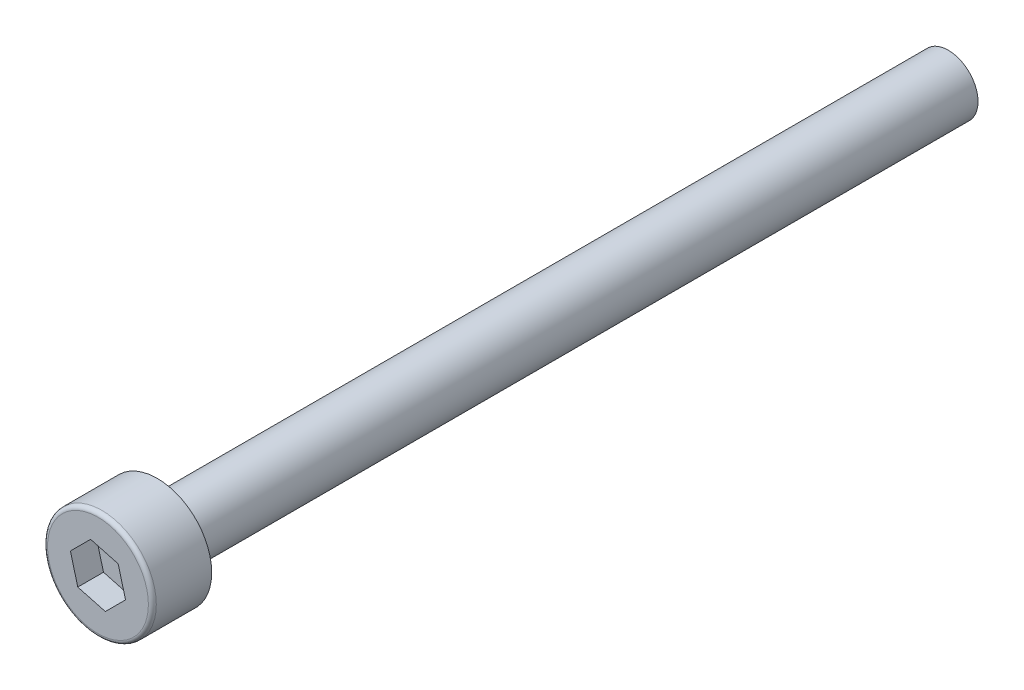
ISO-10303-21;
HEADER;
FILE_DESCRIPTION(('STEP AP214'),'2;1');
FILE_NAME('part.step','',(''),(''),'','','');
FILE_SCHEMA(('AUTOMOTIVE_DESIGN { 1 0 10303 214 1 1 1 1 }'));
ENDSEC;
DATA;
#1=APPLICATION_CONTEXT('core data for automotive mechanical design processes');
#2=APPLICATION_PROTOCOL_DEFINITION('international standard','automotive_design',2000,#1);
#3=PRODUCT_CONTEXT('',#1,'mechanical');
#4=PRODUCT('Part','Part','',(#3));
#5=PRODUCT_RELATED_PRODUCT_CATEGORY('part','',(#4));
#6=PRODUCT_DEFINITION_FORMATION('','',#4);
#7=PRODUCT_DEFINITION_CONTEXT('part definition',#1,'design');
#8=PRODUCT_DEFINITION('design','',#6,#7);
#9=PRODUCT_DEFINITION_SHAPE('','',#8);
#10=(LENGTH_UNIT() NAMED_UNIT(*) SI_UNIT(.MILLI.,.METRE.));
#11=(NAMED_UNIT(*) PLANE_ANGLE_UNIT() SI_UNIT($,.RADIAN.));
#12=(NAMED_UNIT(*) SI_UNIT($,.STERADIAN.) SOLID_ANGLE_UNIT());
#13=UNCERTAINTY_MEASURE_WITH_UNIT(LENGTH_MEASURE(1.E-05),#10,'distance_accuracy_value','');
#14=(GEOMETRIC_REPRESENTATION_CONTEXT(3) GLOBAL_UNCERTAINTY_ASSIGNED_CONTEXT((#13)) GLOBAL_UNIT_ASSIGNED_CONTEXT((#10,
#11,#12)) REPRESENTATION_CONTEXT('',''));
#15=CARTESIAN_POINT('',(0.,0.,0.));
#16=DIRECTION('',(0.,0.,1.));
#17=DIRECTION('',(1.,0.,0.));
#18=AXIS2_PLACEMENT_3D('',#15,#16,#17);
#19=CARTESIAN_POINT('',(0.,0.,0.));
#20=DIRECTION('',(0.,0.,1.));
#21=DIRECTION('',(1.,0.,0.));
#22=AXIS2_PLACEMENT_3D('',#19,#20,#21);
#23=PLANE('',#22);
#24=CARTESIAN_POINT('',(0.,0.,0.));
#25=DIRECTION('',(0.,0.,1.));
#26=DIRECTION('',(1.,0.,0.));
#27=AXIS2_PLACEMENT_3D('',#24,#25,#26);
#28=CIRCLE('',#27,2.75);
#29=CARTESIAN_POINT('',(2.75,0.,0.));
#30=VERTEX_POINT('',#29);
#31=EDGE_CURVE('E140',#30,#30,#28,.T.);
#32=ORIENTED_EDGE('',*,*,#31,.F.);
#33=EDGE_LOOP('',(#32));
#34=FACE_BOUND('',#33,.T.);
#35=CARTESIAN_POINT('',(0.,0.,0.));
#36=DIRECTION('',(0.,0.,1.));
#37=DIRECTION('',(1.,0.,0.));
#38=AXIS2_PLACEMENT_3D('',#35,#36,#37);
#39=CIRCLE('',#38,1.5);
#40=CARTESIAN_POINT('',(1.5,0.,0.));
#41=VERTEX_POINT('',#40);
#42=EDGE_CURVE('E148',#41,#41,#39,.F.);
#43=ORIENTED_EDGE('',*,*,#42,.F.);
#44=EDGE_LOOP('',(#43));
#45=FACE_BOUND('',#44,.T.);
#46=ADVANCED_FACE('F37',(#34,#45),#23,.F.);
#47=CARTESIAN_POINT('',(0.,0.,3.));
#48=DIRECTION('',(0.,0.,-1.));
#49=DIRECTION('',(-1.,0.,0.));
#50=AXIS2_PLACEMENT_3D('',#47,#48,#49);
#51=CYLINDRICAL_SURFACE('',#50,2.75);
#52=CARTESIAN_POINT('',(0.,0.,2.8));
#53=DIRECTION('',(0.,0.,1.));
#54=DIRECTION('',(1.,0.,0.));
#55=AXIS2_PLACEMENT_3D('',#52,#53,#54);
#56=CIRCLE('',#55,2.75);
#57=CARTESIAN_POINT('',(2.75,0.,2.8));
#58=VERTEX_POINT('',#57);
#59=EDGE_CURVE('E11',#58,#58,#56,.F.);
#60=ORIENTED_EDGE('',*,*,#59,.T.);
#61=EDGE_LOOP('',(#60));
#62=FACE_BOUND('',#61,.T.);
#63=ORIENTED_EDGE('',*,*,#31,.T.);
#64=EDGE_LOOP('',(#63));
#65=FACE_BOUND('',#64,.T.);
#66=ADVANCED_FACE('F167',(#62,#65),#51,.T.);
#67=CARTESIAN_POINT('',(0.,0.,3.));
#68=DIRECTION('',(0.,0.,1.));
#69=DIRECTION('',(1.,0.,0.));
#70=AXIS2_PLACEMENT_3D('',#67,#68,#69);
#71=PLANE('',#70);
#72=CARTESIAN_POINT('',(0.,0.,3.));
#73=DIRECTION('',(0.,0.,1.));
#74=DIRECTION('',(1.,0.,0.));
#75=AXIS2_PLACEMENT_3D('',#72,#73,#74);
#76=CIRCLE('',#75,2.55);
#77=CARTESIAN_POINT('',(2.55,0.,3.));
#78=VERTEX_POINT('',#77);
#79=EDGE_CURVE('E45',#78,#78,#76,.T.);
#80=ORIENTED_EDGE('',*,*,#79,.T.);
#81=EDGE_LOOP('',(#80));
#82=FACE_BOUND('',#81,.T.);
#83=DIRECTION('',(0.258819045102521,-0.965925826289068,0.));
#84=VECTOR('',#83,1.);
#85=CARTESIAN_POINT('',(-1.39419383956301,0.373573113403356,3.));
#86=LINE('',#85,#84);
#87=CARTESIAN_POINT('',(-1.39419383956301,0.373573113403356,3.));
#88=VERTEX_POINT('',#87);
#89=CARTESIAN_POINT('',(-1.02062072615966,-1.02062072615966,3.));
#90=VERTEX_POINT('',#89);
#91=EDGE_CURVE('E52',#88,#90,#86,.T.);
#92=ORIENTED_EDGE('',*,*,#91,.F.);
#93=DIRECTION('',(-0.707106781186548,-0.707106781186548,0.));
#94=VECTOR('',#93,1.);
#95=CARTESIAN_POINT('',(-0.373573113403355,1.39419383956301,3.));
#96=LINE('',#95,#94);
#97=CARTESIAN_POINT('',(-0.373573113403355,1.39419383956301,3.));
#98=VERTEX_POINT('',#97);
#99=EDGE_CURVE('E136',#98,#88,#96,.T.);
#100=ORIENTED_EDGE('',*,*,#99,.F.);
#101=DIRECTION('',(-0.965925826289068,0.258819045102521,0.));
#102=VECTOR('',#101,1.);
#103=CARTESIAN_POINT('',(1.02062072615966,1.02062072615966,3.));
#104=LINE('',#103,#102);
#105=CARTESIAN_POINT('',(1.02062072615966,1.02062072615966,3.));
#106=VERTEX_POINT('',#105);
#107=EDGE_CURVE('E134',#106,#98,#104,.T.);
#108=ORIENTED_EDGE('',*,*,#107,.F.);
#109=DIRECTION('',(-0.258819045102521,0.965925826289068,0.));
#110=VECTOR('',#109,1.);
#111=CARTESIAN_POINT('',(1.39419383956301,-0.373573113403355,3.));
#112=LINE('',#111,#110);
#113=CARTESIAN_POINT('',(1.39419383956301,-0.373573113403355,3.));
#114=VERTEX_POINT('',#113);
#115=EDGE_CURVE('E100',#114,#106,#112,.T.);
#116=ORIENTED_EDGE('',*,*,#115,.F.);
#117=DIRECTION('',(0.707106781186548,0.707106781186548,0.));
#118=VECTOR('',#117,1.);
#119=CARTESIAN_POINT('',(0.373573113403355,-1.39419383956301,3.));
#120=LINE('',#119,#118);
#121=CARTESIAN_POINT('',(0.373573113403355,-1.39419383956301,3.));
#122=VERTEX_POINT('',#121);
#123=EDGE_CURVE('E130',#122,#114,#120,.T.);
#124=ORIENTED_EDGE('',*,*,#123,.F.);
#125=DIRECTION('',(0.965925826289068,-0.258819045102521,0.));
#126=VECTOR('',#125,1.);
#127=CARTESIAN_POINT('',(-1.02062072615966,-1.02062072615966,3.));
#128=LINE('',#127,#126);
#129=EDGE_CURVE('E126',#90,#122,#128,.T.);
#130=ORIENTED_EDGE('',*,*,#129,.F.);
#131=EDGE_LOOP('',(#92,#100,#108,#116,#124,#130));
#132=FACE_BOUND('',#131,.T.);
#133=ADVANCED_FACE('F153',(#82,#132),#71,.T.);
#134=CARTESIAN_POINT('',(-1.39419383956301,0.373573113403356,1.7));
#135=DIRECTION('',(-0.965925826289068,-0.258819045102521,0.));
#136=DIRECTION('',(0.258819045102521,-0.965925826289068,0.));
#137=AXIS2_PLACEMENT_3D('',#134,#135,#136);
#138=PLANE('',#137);
#139=ORIENTED_EDGE('',*,*,#91,.T.);
#140=DIRECTION('',(0.,0.,1.));
#141=VECTOR('',#140,1.);
#142=CARTESIAN_POINT('',(-1.02062072615966,-1.02062072615966,1.7));
#143=LINE('',#142,#141);
#144=CARTESIAN_POINT('',(-1.02062072615966,-1.02062072615966,1.7));
#145=VERTEX_POINT('',#144);
#146=EDGE_CURVE('E82',#145,#90,#143,.T.);
#147=ORIENTED_EDGE('',*,*,#146,.F.);
#148=DIRECTION('',(0.258819045102521,-0.965925826289068,0.));
#149=VECTOR('',#148,1.);
#150=CARTESIAN_POINT('',(-1.39419383956301,0.373573113403356,1.7));
#151=LINE('',#150,#149);
#152=CARTESIAN_POINT('',(-1.39419383956301,0.373573113403356,1.7));
#153=VERTEX_POINT('',#152);
#154=EDGE_CURVE('E138',#153,#145,#151,.T.);
#155=ORIENTED_EDGE('',*,*,#154,.F.);
#156=DIRECTION('',(0.,0.,1.));
#157=VECTOR('',#156,1.);
#158=CARTESIAN_POINT('',(-1.39419383956301,0.373573113403356,1.7));
#159=LINE('',#158,#157);
#160=EDGE_CURVE('E60',#153,#88,#159,.T.);
#161=ORIENTED_EDGE('',*,*,#160,.T.);
#162=EDGE_LOOP('',(#139,#147,#155,#161));
#163=FACE_BOUND('',#162,.T.);
#164=ADVANCED_FACE('F179',(#163),#138,.F.);
#165=CARTESIAN_POINT('',(-0.373573113403355,1.39419383956301,1.7));
#166=DIRECTION('',(-0.707106781186548,0.707106781186548,0.));
#167=DIRECTION('',(-0.707106781186548,-0.707106781186548,0.));
#168=AXIS2_PLACEMENT_3D('',#165,#166,#167);
#169=PLANE('',#168);
#170=ORIENTED_EDGE('',*,*,#99,.T.);
#171=ORIENTED_EDGE('',*,*,#160,.F.);
#172=DIRECTION('',(-0.707106781186548,-0.707106781186548,0.));
#173=VECTOR('',#172,1.);
#174=CARTESIAN_POINT('',(-0.373573113403355,1.39419383956301,1.7));
#175=LINE('',#174,#173);
#176=CARTESIAN_POINT('',(-0.373573113403355,1.39419383956301,1.7));
#177=VERTEX_POINT('',#176);
#178=EDGE_CURVE('E112',#177,#153,#175,.T.);
#179=ORIENTED_EDGE('',*,*,#178,.F.);
#180=DIRECTION('',(0.,0.,1.));
#181=VECTOR('',#180,1.);
#182=CARTESIAN_POINT('',(-0.373573113403355,1.39419383956301,1.7));
#183=LINE('',#182,#181);
#184=EDGE_CURVE('E104',#177,#98,#183,.T.);
#185=ORIENTED_EDGE('',*,*,#184,.T.);
#186=EDGE_LOOP('',(#170,#171,#179,#185));
#187=FACE_BOUND('',#186,.T.);
#188=ADVANCED_FACE('F182',(#187),#169,.F.);
#189=CARTESIAN_POINT('',(1.02062072615966,1.02062072615966,1.7));
#190=DIRECTION('',(0.258819045102521,0.965925826289068,0.));
#191=DIRECTION('',(-0.965925826289068,0.258819045102521,0.));
#192=AXIS2_PLACEMENT_3D('',#189,#190,#191);
#193=PLANE('',#192);
#194=ORIENTED_EDGE('',*,*,#107,.T.);
#195=ORIENTED_EDGE('',*,*,#184,.F.);
#196=DIRECTION('',(-0.965925826289068,0.258819045102521,0.));
#197=VECTOR('',#196,1.);
#198=CARTESIAN_POINT('',(1.02062072615966,1.02062072615966,1.7));
#199=LINE('',#198,#197);
#200=CARTESIAN_POINT('',(1.02062072615966,1.02062072615966,1.7));
#201=VERTEX_POINT('',#200);
#202=EDGE_CURVE('E108',#201,#177,#199,.T.);
#203=ORIENTED_EDGE('',*,*,#202,.F.);
#204=DIRECTION('',(0.,0.,1.));
#205=VECTOR('',#204,1.);
#206=CARTESIAN_POINT('',(1.02062072615966,1.02062072615966,1.7));
#207=LINE('',#206,#205);
#208=EDGE_CURVE('E93',#201,#106,#207,.T.);
#209=ORIENTED_EDGE('',*,*,#208,.T.);
#210=EDGE_LOOP('',(#194,#195,#203,#209));
#211=FACE_BOUND('',#210,.T.);
#212=ADVANCED_FACE('F109',(#211),#193,.F.);
#213=CARTESIAN_POINT('',(1.39419383956301,-0.373573113403355,1.7));
#214=DIRECTION('',(0.965925826289068,0.258819045102521,0.));
#215=DIRECTION('',(-0.258819045102521,0.965925826289068,0.));
#216=AXIS2_PLACEMENT_3D('',#213,#214,#215);
#217=PLANE('',#216);
#218=ORIENTED_EDGE('',*,*,#115,.T.);
#219=ORIENTED_EDGE('',*,*,#208,.F.);
#220=DIRECTION('',(-0.258819045102521,0.965925826289068,0.));
#221=VECTOR('',#220,1.);
#222=CARTESIAN_POINT('',(1.39419383956301,-0.373573113403355,1.7));
#223=LINE('',#222,#221);
#224=CARTESIAN_POINT('',(1.39419383956301,-0.373573113403355,1.7));
#225=VERTEX_POINT('',#224);
#226=EDGE_CURVE('E97',#225,#201,#223,.T.);
#227=ORIENTED_EDGE('',*,*,#226,.F.);
#228=DIRECTION('',(0.,0.,1.));
#229=VECTOR('',#228,1.);
#230=CARTESIAN_POINT('',(1.39419383956301,-0.373573113403355,1.7));
#231=LINE('',#230,#229);
#232=EDGE_CURVE('E105',#225,#114,#231,.T.);
#233=ORIENTED_EDGE('',*,*,#232,.T.);
#234=EDGE_LOOP('',(#218,#219,#227,#233));
#235=FACE_BOUND('',#234,.T.);
#236=ADVANCED_FACE('F95',(#235),#217,.F.);
#237=CARTESIAN_POINT('',(0.373573113403355,-1.39419383956301,1.7));
#238=DIRECTION('',(0.707106781186548,-0.707106781186548,0.));
#239=DIRECTION('',(0.707106781186548,0.707106781186548,0.));
#240=AXIS2_PLACEMENT_3D('',#237,#238,#239);
#241=PLANE('',#240);
#242=ORIENTED_EDGE('',*,*,#123,.T.);
#243=ORIENTED_EDGE('',*,*,#232,.F.);
#244=DIRECTION('',(0.707106781186548,0.707106781186548,0.));
#245=VECTOR('',#244,1.);
#246=CARTESIAN_POINT('',(0.373573113403355,-1.39419383956301,1.7));
#247=LINE('',#246,#245);
#248=CARTESIAN_POINT('',(0.373573113403355,-1.39419383956301,1.7));
#249=VERTEX_POINT('',#248);
#250=EDGE_CURVE('E118',#249,#225,#247,.T.);
#251=ORIENTED_EDGE('',*,*,#250,.F.);
#252=DIRECTION('',(0.,0.,1.));
#253=VECTOR('',#252,1.);
#254=CARTESIAN_POINT('',(0.373573113403355,-1.39419383956301,1.7));
#255=LINE('',#254,#253);
#256=EDGE_CURVE('E143',#249,#122,#255,.T.);
#257=ORIENTED_EDGE('',*,*,#256,.T.);
#258=EDGE_LOOP('',(#242,#243,#251,#257));
#259=FACE_BOUND('',#258,.T.);
#260=ADVANCED_FACE('F186',(#259),#241,.F.);
#261=CARTESIAN_POINT('',(-1.02062072615966,-1.02062072615966,1.7));
#262=DIRECTION('',(-0.258819045102521,-0.965925826289068,0.));
#263=DIRECTION('',(0.965925826289068,-0.258819045102521,0.));
#264=AXIS2_PLACEMENT_3D('',#261,#262,#263);
#265=PLANE('',#264);
#266=ORIENTED_EDGE('',*,*,#129,.T.);
#267=ORIENTED_EDGE('',*,*,#256,.F.);
#268=DIRECTION('',(0.965925826289068,-0.258819045102521,0.));
#269=VECTOR('',#268,1.);
#270=CARTESIAN_POINT('',(-1.02062072615966,-1.02062072615966,1.7));
#271=LINE('',#270,#269);
#272=EDGE_CURVE('E120',#145,#249,#271,.T.);
#273=ORIENTED_EDGE('',*,*,#272,.F.);
#274=ORIENTED_EDGE('',*,*,#146,.T.);
#275=EDGE_LOOP('',(#266,#267,#273,#274));
#276=FACE_BOUND('',#275,.T.);
#277=ADVANCED_FACE('F183',(#276),#265,.F.);
#278=CARTESIAN_POINT('',(0.,0.,1.7));
#279=DIRECTION('',(0.,0.,1.));
#280=DIRECTION('',(1.,0.,0.));
#281=AXIS2_PLACEMENT_3D('',#278,#279,#280);
#282=PLANE('',#281);
#283=ORIENTED_EDGE('',*,*,#154,.T.);
#284=ORIENTED_EDGE('',*,*,#272,.T.);
#285=ORIENTED_EDGE('',*,*,#250,.T.);
#286=ORIENTED_EDGE('',*,*,#226,.T.);
#287=ORIENTED_EDGE('',*,*,#202,.T.);
#288=ORIENTED_EDGE('',*,*,#178,.T.);
#289=EDGE_LOOP('',(#283,#284,#285,#286,#287,#288));
#290=FACE_BOUND('',#289,.T.);
#291=ADVANCED_FACE('F115',(#290),#282,.T.);
#292=CARTESIAN_POINT('',(0.,0.,-40.));
#293=DIRECTION('',(0.,0.,1.));
#294=DIRECTION('',(1.,0.,0.));
#295=AXIS2_PLACEMENT_3D('',#292,#293,#294);
#296=CYLINDRICAL_SURFACE('',#295,1.5);
#297=CARTESIAN_POINT('',(0.,0.,-40.));
#298=DIRECTION('',(0.,0.,-1.));
#299=DIRECTION('',(-1.,0.,0.));
#300=AXIS2_PLACEMENT_3D('',#297,#298,#299);
#301=CIRCLE('',#300,1.5);
#302=CARTESIAN_POINT('',(-1.5,0.,-40.));
#303=VERTEX_POINT('',#302);
#304=EDGE_CURVE('E127',#303,#303,#301,.T.);
#305=ORIENTED_EDGE('',*,*,#304,.F.);
#306=EDGE_LOOP('',(#305));
#307=FACE_BOUND('',#306,.T.);
#308=ORIENTED_EDGE('',*,*,#42,.T.);
#309=EDGE_LOOP('',(#308));
#310=FACE_BOUND('',#309,.T.);
#311=ADVANCED_FACE('F162',(#307,#310),#296,.T.);
#312=CARTESIAN_POINT('',(0.,0.,-40.));
#313=DIRECTION('',(0.,0.,-1.));
#314=DIRECTION('',(-1.,0.,0.));
#315=AXIS2_PLACEMENT_3D('',#312,#313,#314);
#316=PLANE('',#315);
#317=ORIENTED_EDGE('',*,*,#304,.T.);
#318=EDGE_LOOP('',(#317));
#319=FACE_BOUND('',#318,.T.);
#320=ADVANCED_FACE('F157',(#319),#316,.T.);
#321=CARTESIAN_POINT('',(0.,0.,2.8));
#322=DIRECTION('',(0.,0.,1.));
#323=DIRECTION('',(1.,0.,0.));
#324=AXIS2_PLACEMENT_3D('',#321,#322,#323);
#325=TOROIDAL_SURFACE('',#324,2.55,0.2);
#326=ORIENTED_EDGE('',*,*,#59,.F.);
#327=EDGE_LOOP('',(#326));
#328=FACE_BOUND('',#327,.T.);
#329=ORIENTED_EDGE('',*,*,#79,.F.);
#330=EDGE_LOOP('',(#329));
#331=FACE_BOUND('',#330,.T.);
#332=ADVANCED_FACE('F39',(#328,#331),#325,.T.);
#333=CLOSED_SHELL('',(#46,#66,#133,#164,#188,#212,#236,#260,#277,#291,#311,#320,#332));
#334=MANIFOLD_SOLID_BREP('B2',#333);
#335=ADVANCED_BREP_SHAPE_REPRESENTATION('',(#18,#334),#14);
#336=SHAPE_DEFINITION_REPRESENTATION(#9,#335);
ENDSEC;
END-ISO-10303-21;
